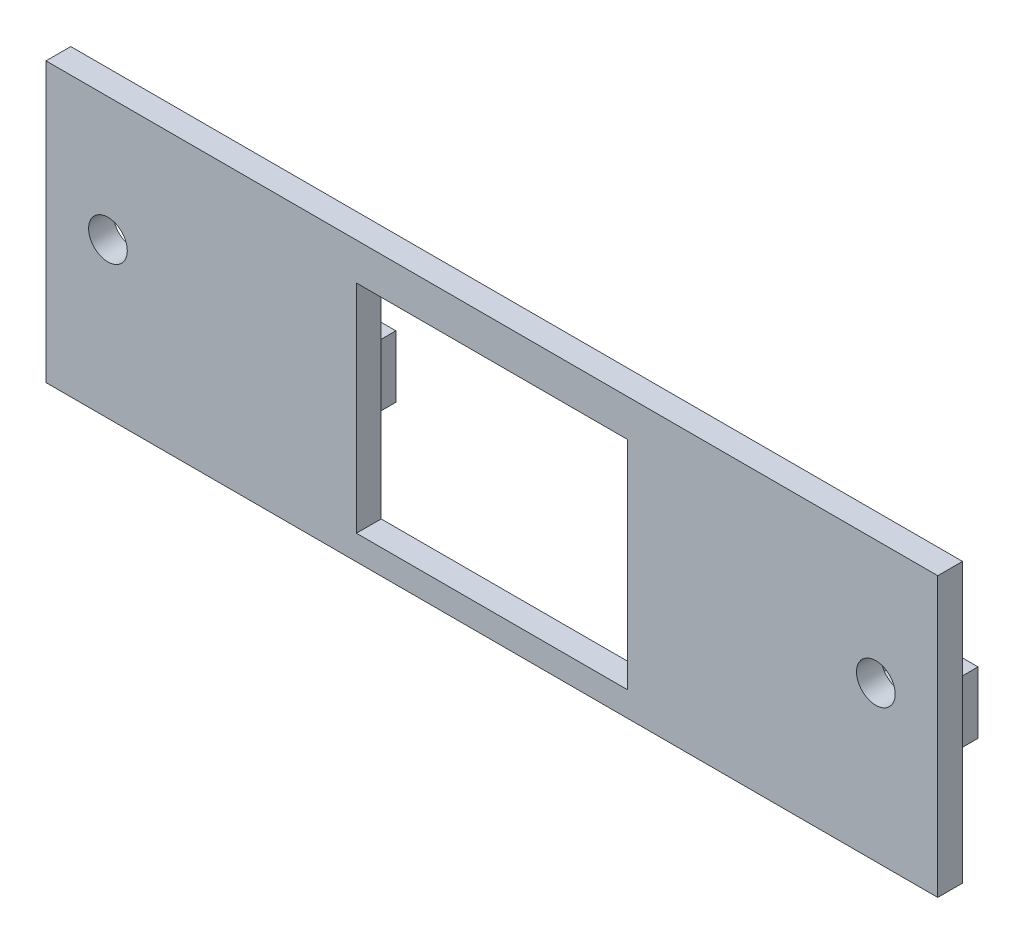
ISO-10303-21;
HEADER;
FILE_DESCRIPTION(('STEP AP214'),'2;1');
FILE_NAME('part.step','',(''),(''),'','','');
FILE_SCHEMA(('AUTOMOTIVE_DESIGN { 1 0 10303 214 1 1 1 1 }'));
ENDSEC;
DATA;
#1=APPLICATION_CONTEXT('core data for automotive mechanical design processes');
#2=APPLICATION_PROTOCOL_DEFINITION('international standard','automotive_design',2000,#1);
#3=PRODUCT_CONTEXT('',#1,'mechanical');
#4=PRODUCT('Part','Part','',(#3));
#5=PRODUCT_RELATED_PRODUCT_CATEGORY('part','',(#4));
#6=PRODUCT_DEFINITION_FORMATION('','',#4);
#7=PRODUCT_DEFINITION_CONTEXT('part definition',#1,'design');
#8=PRODUCT_DEFINITION('design','',#6,#7);
#9=PRODUCT_DEFINITION_SHAPE('','',#8);
#10=(LENGTH_UNIT() NAMED_UNIT(*) SI_UNIT(.MILLI.,.METRE.));
#11=(NAMED_UNIT(*) PLANE_ANGLE_UNIT() SI_UNIT($,.RADIAN.));
#12=(NAMED_UNIT(*) SI_UNIT($,.STERADIAN.) SOLID_ANGLE_UNIT());
#13=UNCERTAINTY_MEASURE_WITH_UNIT(LENGTH_MEASURE(1.E-05),#10,'distance_accuracy_value','');
#14=(GEOMETRIC_REPRESENTATION_CONTEXT(3) GLOBAL_UNCERTAINTY_ASSIGNED_CONTEXT((#13)) GLOBAL_UNIT_ASSIGNED_CONTEXT((#10,
#11,#12)) REPRESENTATION_CONTEXT('',''));
#15=CARTESIAN_POINT('',(0.,0.,0.));
#16=DIRECTION('',(0.,0.,1.));
#17=DIRECTION('',(1.,0.,0.));
#18=AXIS2_PLACEMENT_3D('',#15,#16,#17);
#19=CARTESIAN_POINT('',(0.,5.6,0.));
#20=DIRECTION('',(0.,-1.,0.));
#21=DIRECTION('',(0.,0.,-1.));
#22=AXIS2_PLACEMENT_3D('',#19,#20,#21);
#23=PLANE('',#22);
#24=DIRECTION('',(0.,0.,1.));
#25=VECTOR('',#24,1.);
#26=CARTESIAN_POINT('',(-22.8,5.6,0.));
#27=LINE('',#26,#25);
#28=CARTESIAN_POINT('',(-22.8,5.6,-7.));
#29=VERTEX_POINT('',#28);
#30=CARTESIAN_POINT('',(-22.8,5.6,-0.5));
#31=VERTEX_POINT('',#30);
#32=EDGE_CURVE('E301',#29,#31,#27,.T.);
#33=ORIENTED_EDGE('',*,*,#32,.T.);
#34=DIRECTION('',(1.,0.,0.));
#35=VECTOR('',#34,1.);
#36=CARTESIAN_POINT('',(-14.8,5.6,-0.5));
#37=LINE('',#36,#35);
#38=CARTESIAN_POINT('',(-14.8,5.6,-0.5));
#39=VERTEX_POINT('',#38);
#40=EDGE_CURVE('E344',#31,#39,#37,.T.);
#41=ORIENTED_EDGE('',*,*,#40,.T.);
#42=DIRECTION('',(0.,0.,-1.));
#43=VECTOR('',#42,1.);
#44=CARTESIAN_POINT('',(-14.8,5.6,0.));
#45=LINE('',#44,#43);
#46=CARTESIAN_POINT('',(-14.8,5.6,-7.));
#47=VERTEX_POINT('',#46);
#48=EDGE_CURVE('E302',#39,#47,#45,.T.);
#49=ORIENTED_EDGE('',*,*,#48,.T.);
#50=DIRECTION('',(-1.,0.,0.));
#51=VECTOR('',#50,1.);
#52=CARTESIAN_POINT('',(-22.8,5.6,-7.));
#53=LINE('',#52,#51);
#54=EDGE_CURVE('E310',#47,#29,#53,.T.);
#55=ORIENTED_EDGE('',*,*,#54,.T.);
#56=EDGE_LOOP('',(#33,#41,#49,#55));
#57=FACE_BOUND('',#56,.T.);
#58=CARTESIAN_POINT('',(-18.8,5.6,-4.2));
#59=DIRECTION('',(0.,1.,0.));
#60=DIRECTION('',(0.,0.,1.));
#61=AXIS2_PLACEMENT_3D('',#58,#59,#60);
#62=CIRCLE('',#61,1.3);
#63=CARTESIAN_POINT('',(-18.8,5.6,-2.9));
#64=VERTEX_POINT('',#63);
#65=EDGE_CURVE('E294',#64,#64,#62,.T.);
#66=ORIENTED_EDGE('',*,*,#65,.F.);
#67=EDGE_LOOP('',(#66));
#68=FACE_BOUND('',#67,.T.);
#69=ADVANCED_FACE('F41',(#57,#68),#23,.F.);
#70=CARTESIAN_POINT('',(0.,1.6,0.));
#71=DIRECTION('',(0.,-1.,0.));
#72=DIRECTION('',(0.,0.,-1.));
#73=AXIS2_PLACEMENT_3D('',#70,#71,#72);
#74=PLANE('',#73);
#75=DIRECTION('',(0.,0.,1.));
#76=VECTOR('',#75,1.);
#77=CARTESIAN_POINT('',(-22.8,1.6,0.));
#78=LINE('',#77,#76);
#79=CARTESIAN_POINT('',(-22.8,1.6,-7.));
#80=VERTEX_POINT('',#79);
#81=CARTESIAN_POINT('',(-22.8,1.6,-0.5));
#82=VERTEX_POINT('',#81);
#83=EDGE_CURVE('E296',#80,#82,#78,.T.);
#84=ORIENTED_EDGE('',*,*,#83,.F.);
#85=DIRECTION('',(-1.,0.,0.));
#86=VECTOR('',#85,1.);
#87=CARTESIAN_POINT('',(-22.8,1.6,-7.));
#88=LINE('',#87,#86);
#89=CARTESIAN_POINT('',(-14.8,1.6,-7.));
#90=VERTEX_POINT('',#89);
#91=EDGE_CURVE('E304',#90,#80,#88,.T.);
#92=ORIENTED_EDGE('',*,*,#91,.F.);
#93=DIRECTION('',(0.,0.,-1.));
#94=VECTOR('',#93,1.);
#95=CARTESIAN_POINT('',(-14.8,1.6,0.));
#96=LINE('',#95,#94);
#97=CARTESIAN_POINT('',(-14.8,1.6,-0.5));
#98=VERTEX_POINT('',#97);
#99=EDGE_CURVE('E313',#98,#90,#96,.T.);
#100=ORIENTED_EDGE('',*,*,#99,.F.);
#101=CARTESIAN_POINT('',(-14.3,1.6,-0.5));
#102=DIRECTION('',(0.,-1.,0.));
#103=DIRECTION('',(0.,0.,-1.));
#104=AXIS2_PLACEMENT_3D('',#101,#102,#103);
#105=CIRCLE('',#104,0.5);
#106=CARTESIAN_POINT('',(-14.3,1.6,0.));
#107=VERTEX_POINT('',#106);
#108=EDGE_CURVE('E350',#98,#107,#105,.F.);
#109=ORIENTED_EDGE('',*,*,#108,.T.);
#110=DIRECTION('',(1.,0.,0.));
#111=VECTOR('',#110,1.);
#112=CARTESIAN_POINT('',(-22.8,1.6,0.));
#113=LINE('',#112,#111);
#114=CARTESIAN_POINT('',(-23.3,1.6,0.));
#115=VERTEX_POINT('',#114);
#116=EDGE_CURVE('E315',#115,#107,#113,.T.);
#117=ORIENTED_EDGE('',*,*,#116,.F.);
#118=CARTESIAN_POINT('',(-23.3,1.6,-0.5));
#119=DIRECTION('',(0.,-1.,0.));
#120=DIRECTION('',(0.,0.,-1.));
#121=AXIS2_PLACEMENT_3D('',#118,#119,#120);
#122=CIRCLE('',#121,0.5);
#123=EDGE_CURVE('E349',#115,#82,#122,.F.);
#124=ORIENTED_EDGE('',*,*,#123,.T.);
#125=EDGE_LOOP('',(#84,#92,#100,#109,#117,#124));
#126=FACE_BOUND('',#125,.T.);
#127=CARTESIAN_POINT('',(-18.8,1.6,-4.2));
#128=DIRECTION('',(0.,1.,0.));
#129=DIRECTION('',(0.,0.,1.));
#130=AXIS2_PLACEMENT_3D('',#127,#128,#129);
#131=CIRCLE('',#130,1.3);
#132=CARTESIAN_POINT('',(-18.8,1.6,-2.9));
#133=VERTEX_POINT('',#132);
#134=EDGE_CURVE('E295',#133,#133,#131,.T.);
#135=ORIENTED_EDGE('',*,*,#134,.T.);
#136=EDGE_LOOP('',(#135));
#137=FACE_BOUND('',#136,.T.);
#138=ADVANCED_FACE('F392',(#126,#137),#74,.T.);
#139=CARTESIAN_POINT('',(-22.8,5.6,0.));
#140=DIRECTION('',(1.,0.,0.));
#141=DIRECTION('',(0.,0.,-1.));
#142=AXIS2_PLACEMENT_3D('',#139,#140,#141);
#143=PLANE('',#142);
#144=ORIENTED_EDGE('',*,*,#83,.T.);
#145=DIRECTION('',(0.,-1.,0.));
#146=VECTOR('',#145,1.);
#147=CARTESIAN_POINT('',(-22.8,5.6,-0.5));
#148=LINE('',#147,#146);
#149=EDGE_CURVE('E339',#82,#31,#148,.F.);
#150=ORIENTED_EDGE('',*,*,#149,.T.);
#151=ORIENTED_EDGE('',*,*,#32,.F.);
#152=DIRECTION('',(0.,-1.,0.));
#153=VECTOR('',#152,1.);
#154=CARTESIAN_POINT('',(-22.8,5.6,-7.));
#155=LINE('',#154,#153);
#156=EDGE_CURVE('E307',#29,#80,#155,.T.);
#157=ORIENTED_EDGE('',*,*,#156,.T.);
#158=EDGE_LOOP('',(#144,#150,#151,#157));
#159=FACE_BOUND('',#158,.T.);
#160=ADVANCED_FACE('F402',(#159),#143,.F.);
#161=CARTESIAN_POINT('',(-14.8,5.6,0.));
#162=DIRECTION('',(-1.,0.,0.));
#163=DIRECTION('',(0.,0.,1.));
#164=AXIS2_PLACEMENT_3D('',#161,#162,#163);
#165=PLANE('',#164);
#166=ORIENTED_EDGE('',*,*,#48,.F.);
#167=DIRECTION('',(0.,-1.,0.));
#168=VECTOR('',#167,1.);
#169=CARTESIAN_POINT('',(-14.8,1.6,-0.5));
#170=LINE('',#169,#168);
#171=EDGE_CURVE('E321',#39,#98,#170,.T.);
#172=ORIENTED_EDGE('',*,*,#171,.T.);
#173=ORIENTED_EDGE('',*,*,#99,.T.);
#174=DIRECTION('',(0.,-1.,0.));
#175=VECTOR('',#174,1.);
#176=CARTESIAN_POINT('',(-14.8,5.6,-7.));
#177=LINE('',#176,#175);
#178=EDGE_CURVE('E316',#47,#90,#177,.T.);
#179=ORIENTED_EDGE('',*,*,#178,.F.);
#180=EDGE_LOOP('',(#166,#172,#173,#179));
#181=FACE_BOUND('',#180,.T.);
#182=ADVANCED_FACE('F415',(#181),#165,.F.);
#183=CARTESIAN_POINT('',(-22.8,5.6,-7.));
#184=DIRECTION('',(0.,0.,1.));
#185=DIRECTION('',(1.,0.,0.));
#186=AXIS2_PLACEMENT_3D('',#183,#184,#185);
#187=PLANE('',#186);
#188=ORIENTED_EDGE('',*,*,#91,.T.);
#189=ORIENTED_EDGE('',*,*,#156,.F.);
#190=ORIENTED_EDGE('',*,*,#54,.F.);
#191=ORIENTED_EDGE('',*,*,#178,.T.);
#192=EDGE_LOOP('',(#188,#189,#190,#191));
#193=FACE_BOUND('',#192,.T.);
#194=ADVANCED_FACE('F408',(#193),#187,.F.);
#195=CARTESIAN_POINT('',(-18.8,5.6,-4.2));
#196=DIRECTION('',(0.,-1.,0.));
#197=DIRECTION('',(0.,0.,-1.));
#198=AXIS2_PLACEMENT_3D('',#195,#196,#197);
#199=CYLINDRICAL_SURFACE('',#198,1.3);
#200=ORIENTED_EDGE('',*,*,#65,.T.);
#201=EDGE_LOOP('',(#200));
#202=FACE_BOUND('',#201,.T.);
#203=ORIENTED_EDGE('',*,*,#134,.F.);
#204=EDGE_LOOP('',(#203));
#205=FACE_BOUND('',#204,.T.);
#206=ADVANCED_FACE('F409',(#202,#205),#199,.F.);
#207=CARTESIAN_POINT('',(0.,0.,0.));
#208=DIRECTION('',(0.,0.,1.));
#209=DIRECTION('',(1.,0.,0.));
#210=AXIS2_PLACEMENT_3D('',#207,#208,#209);
#211=PLANE('',#210);
#212=DIRECTION('',(0.,-1.,0.));
#213=VECTOR('',#212,1.);
#214=CARTESIAN_POINT('',(14.3,1.6,0.));
#215=LINE('',#214,#213);
#216=CARTESIAN_POINT('',(14.3,6.1,0.));
#217=VERTEX_POINT('',#216);
#218=CARTESIAN_POINT('',(14.3,1.6,0.));
#219=VERTEX_POINT('',#218);
#220=EDGE_CURVE('E327',#217,#219,#215,.T.);
#221=ORIENTED_EDGE('',*,*,#220,.T.);
#222=DIRECTION('',(1.,0.,0.));
#223=VECTOR('',#222,1.);
#224=CARTESIAN_POINT('',(22.8,1.6,0.));
#225=LINE('',#224,#223);
#226=CARTESIAN_POINT('',(23.3,1.6,0.));
#227=VERTEX_POINT('',#226);
#228=EDGE_CURVE('E201',#219,#227,#225,.T.);
#229=ORIENTED_EDGE('',*,*,#228,.T.);
#230=DIRECTION('',(0.,-1.,0.));
#231=VECTOR('',#230,1.);
#232=CARTESIAN_POINT('',(23.3,5.6,0.));
#233=LINE('',#232,#231);
#234=CARTESIAN_POINT('',(23.3,6.1,0.));
#235=VERTEX_POINT('',#234);
#236=EDGE_CURVE('E330',#227,#235,#233,.F.);
#237=ORIENTED_EDGE('',*,*,#236,.T.);
#238=DIRECTION('',(1.,0.,0.));
#239=VECTOR('',#238,1.);
#240=CARTESIAN_POINT('',(0.,6.1,0.));
#241=LINE('',#240,#239);
#242=EDGE_CURVE('E322',#235,#217,#241,.F.);
#243=ORIENTED_EDGE('',*,*,#242,.T.);
#244=EDGE_LOOP('',(#221,#229,#237,#243));
#245=FACE_BOUND('',#244,.T.);
#246=DIRECTION('',(-1.,0.,0.));
#247=VECTOR('',#246,1.);
#248=CARTESIAN_POINT('',(0.,15.6,0.));
#249=LINE('',#248,#247);
#250=CARTESIAN_POINT('',(8.75,15.6,0.));
#251=VERTEX_POINT('',#250);
#252=CARTESIAN_POINT('',(-8.75,15.6,0.));
#253=VERTEX_POINT('',#252);
#254=EDGE_CURVE('E289',#251,#253,#249,.T.);
#255=ORIENTED_EDGE('',*,*,#254,.T.);
#256=DIRECTION('',(0.,-1.,0.));
#257=VECTOR('',#256,1.);
#258=CARTESIAN_POINT('',(-8.75,0.,0.));
#259=LINE('',#258,#257);
#260=CARTESIAN_POINT('',(-8.75,1.6,0.));
#261=VERTEX_POINT('',#260);
#262=EDGE_CURVE('E293',#253,#261,#259,.T.);
#263=ORIENTED_EDGE('',*,*,#262,.T.);
#264=DIRECTION('',(1.,0.,0.));
#265=VECTOR('',#264,1.);
#266=CARTESIAN_POINT('',(0.,1.6,0.));
#267=LINE('',#266,#265);
#268=CARTESIAN_POINT('',(8.75,1.6,0.));
#269=VERTEX_POINT('',#268);
#270=EDGE_CURVE('E285',#261,#269,#267,.T.);
#271=ORIENTED_EDGE('',*,*,#270,.T.);
#272=DIRECTION('',(0.,1.,0.));
#273=VECTOR('',#272,1.);
#274=CARTESIAN_POINT('',(8.75,0.,0.));
#275=LINE('',#274,#273);
#276=EDGE_CURVE('E284',#269,#251,#275,.T.);
#277=ORIENTED_EDGE('',*,*,#276,.T.);
#278=EDGE_LOOP('',(#255,#263,#271,#277));
#279=FACE_BOUND('',#278,.T.);
#280=DIRECTION('',(0.,-1.,0.));
#281=VECTOR('',#280,1.);
#282=CARTESIAN_POINT('',(-28.8,18.,0.));
#283=LINE('',#282,#281);
#284=CARTESIAN_POINT('',(-28.8,18.,0.));
#285=VERTEX_POINT('',#284);
#286=CARTESIAN_POINT('',(-28.8,0.,0.));
#287=VERTEX_POINT('',#286);
#288=EDGE_CURVE('E249',#285,#287,#283,.T.);
#289=ORIENTED_EDGE('',*,*,#288,.F.);
#290=DIRECTION('',(-1.,0.,0.));
#291=VECTOR('',#290,1.);
#292=CARTESIAN_POINT('',(-28.8,18.,0.));
#293=LINE('',#292,#291);
#294=CARTESIAN_POINT('',(28.8,18.,0.));
#295=VERTEX_POINT('',#294);
#296=EDGE_CURVE('E256',#295,#285,#293,.T.);
#297=ORIENTED_EDGE('',*,*,#296,.F.);
#298=DIRECTION('',(0.,1.,0.));
#299=VECTOR('',#298,1.);
#300=CARTESIAN_POINT('',(28.8,18.,0.));
#301=LINE('',#300,#299);
#302=CARTESIAN_POINT('',(28.8,0.,0.));
#303=VERTEX_POINT('',#302);
#304=EDGE_CURVE('E269',#303,#295,#301,.T.);
#305=ORIENTED_EDGE('',*,*,#304,.F.);
#306=DIRECTION('',(1.,0.,0.));
#307=VECTOR('',#306,1.);
#308=CARTESIAN_POINT('',(-28.8,0.,0.));
#309=LINE('',#308,#307);
#310=EDGE_CURVE('E267',#287,#303,#309,.T.);
#311=ORIENTED_EDGE('',*,*,#310,.F.);
#312=EDGE_LOOP('',(#289,#297,#305,#311));
#313=FACE_BOUND('',#312,.T.);
#314=CARTESIAN_POINT('',(-24.8,10.,0.));
#315=DIRECTION('',(0.,0.,1.));
#316=DIRECTION('',(1.,0.,0.));
#317=AXIS2_PLACEMENT_3D('',#314,#315,#316);
#318=CIRCLE('',#317,1.25);
#319=CARTESIAN_POINT('',(-23.55,10.,0.));
#320=VERTEX_POINT('',#319);
#321=EDGE_CURVE('E242',#320,#320,#318,.T.);
#322=ORIENTED_EDGE('',*,*,#321,.T.);
#323=EDGE_LOOP('',(#322));
#324=FACE_BOUND('',#323,.T.);
#325=CARTESIAN_POINT('',(24.8,10.,0.));
#326=DIRECTION('',(0.,0.,1.));
#327=DIRECTION('',(1.,0.,0.));
#328=AXIS2_PLACEMENT_3D('',#325,#326,#327);
#329=CIRCLE('',#328,1.25);
#330=CARTESIAN_POINT('',(26.05,10.,0.));
#331=VERTEX_POINT('',#330);
#332=EDGE_CURVE('E234',#331,#331,#329,.T.);
#333=ORIENTED_EDGE('',*,*,#332,.T.);
#334=EDGE_LOOP('',(#333));
#335=FACE_BOUND('',#334,.T.);
#336=DIRECTION('',(0.,-1.,0.));
#337=VECTOR('',#336,1.);
#338=CARTESIAN_POINT('',(-23.3,1.6,0.));
#339=LINE('',#338,#337);
#340=CARTESIAN_POINT('',(-23.3,6.1,0.));
#341=VERTEX_POINT('',#340);
#342=EDGE_CURVE('E331',#341,#115,#339,.T.);
#343=ORIENTED_EDGE('',*,*,#342,.T.);
#344=ORIENTED_EDGE('',*,*,#116,.T.);
#345=DIRECTION('',(0.,-1.,0.));
#346=VECTOR('',#345,1.);
#347=CARTESIAN_POINT('',(-14.3,5.6,0.));
#348=LINE('',#347,#346);
#349=CARTESIAN_POINT('',(-14.3,6.1,0.));
#350=VERTEX_POINT('',#349);
#351=EDGE_CURVE('E340',#107,#350,#348,.F.);
#352=ORIENTED_EDGE('',*,*,#351,.T.);
#353=DIRECTION('',(1.,0.,0.));
#354=VECTOR('',#353,1.);
#355=CARTESIAN_POINT('',(-22.8,6.1,0.));
#356=LINE('',#355,#354);
#357=EDGE_CURVE('E335',#350,#341,#356,.F.);
#358=ORIENTED_EDGE('',*,*,#357,.T.);
#359=EDGE_LOOP('',(#343,#344,#352,#358));
#360=FACE_BOUND('',#359,.T.);
#361=ADVANCED_FACE('F616',(#245,#279,#313,#324,#335,#360),#211,.F.);
#362=CARTESIAN_POINT('',(0.,0.,1.6));
#363=DIRECTION('',(0.,0.,1.));
#364=DIRECTION('',(1.,0.,0.));
#365=AXIS2_PLACEMENT_3D('',#362,#363,#364);
#366=PLANE('',#365);
#367=DIRECTION('',(0.,-1.,0.));
#368=VECTOR('',#367,1.);
#369=CARTESIAN_POINT('',(-8.75,15.6,1.6));
#370=LINE('',#369,#368);
#371=CARTESIAN_POINT('',(-8.75,15.6,1.6));
#372=VERTEX_POINT('',#371);
#373=CARTESIAN_POINT('',(-8.75,1.6,1.6));
#374=VERTEX_POINT('',#373);
#375=EDGE_CURVE('E218',#372,#374,#370,.T.);
#376=ORIENTED_EDGE('',*,*,#375,.F.);
#377=DIRECTION('',(-1.,0.,0.));
#378=VECTOR('',#377,1.);
#379=CARTESIAN_POINT('',(-8.75,15.6,1.6));
#380=LINE('',#379,#378);
#381=CARTESIAN_POINT('',(8.75,15.6,1.6));
#382=VERTEX_POINT('',#381);
#383=EDGE_CURVE('E226',#382,#372,#380,.T.);
#384=ORIENTED_EDGE('',*,*,#383,.F.);
#385=DIRECTION('',(0.,1.,0.));
#386=VECTOR('',#385,1.);
#387=CARTESIAN_POINT('',(8.75,15.6,1.6));
#388=LINE('',#387,#386);
#389=CARTESIAN_POINT('',(8.75,1.6,1.6));
#390=VERTEX_POINT('',#389);
#391=EDGE_CURVE('E223',#390,#382,#388,.T.);
#392=ORIENTED_EDGE('',*,*,#391,.F.);
#393=DIRECTION('',(1.,0.,0.));
#394=VECTOR('',#393,1.);
#395=CARTESIAN_POINT('',(-8.75,1.6,1.6));
#396=LINE('',#395,#394);
#397=EDGE_CURVE('E225',#374,#390,#396,.T.);
#398=ORIENTED_EDGE('',*,*,#397,.F.);
#399=EDGE_LOOP('',(#376,#384,#392,#398));
#400=FACE_BOUND('',#399,.T.);
#401=CARTESIAN_POINT('',(-24.8,10.,1.6));
#402=DIRECTION('',(0.,0.,1.));
#403=DIRECTION('',(1.,0.,0.));
#404=AXIS2_PLACEMENT_3D('',#401,#402,#403);
#405=CIRCLE('',#404,1.25);
#406=CARTESIAN_POINT('',(-23.55,10.,1.6));
#407=VERTEX_POINT('',#406);
#408=EDGE_CURVE('E250',#407,#407,#405,.T.);
#409=ORIENTED_EDGE('',*,*,#408,.F.);
#410=EDGE_LOOP('',(#409));
#411=FACE_BOUND('',#410,.T.);
#412=DIRECTION('',(0.,-1.,0.));
#413=VECTOR('',#412,1.);
#414=CARTESIAN_POINT('',(-28.8,18.,1.6));
#415=LINE('',#414,#413);
#416=CARTESIAN_POINT('',(-28.8,18.,1.6));
#417=VERTEX_POINT('',#416);
#418=CARTESIAN_POINT('',(-28.8,0.,1.6));
#419=VERTEX_POINT('',#418);
#420=EDGE_CURVE('E254',#417,#419,#415,.T.);
#421=ORIENTED_EDGE('',*,*,#420,.T.);
#422=DIRECTION('',(1.,0.,0.));
#423=VECTOR('',#422,1.);
#424=CARTESIAN_POINT('',(-28.8,0.,1.6));
#425=LINE('',#424,#423);
#426=CARTESIAN_POINT('',(28.8,0.,1.6));
#427=VERTEX_POINT('',#426);
#428=EDGE_CURVE('E259',#419,#427,#425,.T.);
#429=ORIENTED_EDGE('',*,*,#428,.T.);
#430=DIRECTION('',(0.,1.,0.));
#431=VECTOR('',#430,1.);
#432=CARTESIAN_POINT('',(28.8,18.,1.6));
#433=LINE('',#432,#431);
#434=CARTESIAN_POINT('',(28.8,18.,1.6));
#435=VERTEX_POINT('',#434);
#436=EDGE_CURVE('E258',#427,#435,#433,.T.);
#437=ORIENTED_EDGE('',*,*,#436,.T.);
#438=DIRECTION('',(-1.,0.,0.));
#439=VECTOR('',#438,1.);
#440=CARTESIAN_POINT('',(-28.8,18.,1.6));
#441=LINE('',#440,#439);
#442=EDGE_CURVE('E261',#435,#417,#441,.T.);
#443=ORIENTED_EDGE('',*,*,#442,.T.);
#444=EDGE_LOOP('',(#421,#429,#437,#443));
#445=FACE_BOUND('',#444,.T.);
#446=CARTESIAN_POINT('',(24.8,10.,1.6));
#447=DIRECTION('',(0.,0.,1.));
#448=DIRECTION('',(1.,0.,0.));
#449=AXIS2_PLACEMENT_3D('',#446,#447,#448);
#450=CIRCLE('',#449,1.25);
#451=CARTESIAN_POINT('',(26.05,10.,1.6));
#452=VERTEX_POINT('',#451);
#453=EDGE_CURVE('E241',#452,#452,#450,.T.);
#454=ORIENTED_EDGE('',*,*,#453,.F.);
#455=EDGE_LOOP('',(#454));
#456=FACE_BOUND('',#455,.T.);
#457=ADVANCED_FACE('F607',(#400,#411,#445,#456),#366,.T.);
#458=CARTESIAN_POINT('',(-28.8,18.,1.6));
#459=DIRECTION('',(1.,0.,0.));
#460=DIRECTION('',(0.,0.,-1.));
#461=AXIS2_PLACEMENT_3D('',#458,#459,#460);
#462=PLANE('',#461);
#463=ORIENTED_EDGE('',*,*,#288,.T.);
#464=DIRECTION('',(0.,0.,-1.));
#465=VECTOR('',#464,1.);
#466=CARTESIAN_POINT('',(-28.8,0.,1.6));
#467=LINE('',#466,#465);
#468=EDGE_CURVE('E278',#419,#287,#467,.T.);
#469=ORIENTED_EDGE('',*,*,#468,.F.);
#470=ORIENTED_EDGE('',*,*,#420,.F.);
#471=DIRECTION('',(0.,0.,-1.));
#472=VECTOR('',#471,1.);
#473=CARTESIAN_POINT('',(-28.8,18.,1.6));
#474=LINE('',#473,#472);
#475=EDGE_CURVE('E263',#417,#285,#474,.T.);
#476=ORIENTED_EDGE('',*,*,#475,.T.);
#477=EDGE_LOOP('',(#463,#469,#470,#476));
#478=FACE_BOUND('',#477,.T.);
#479=ADVANCED_FACE('F599',(#478),#462,.F.);
#480=CARTESIAN_POINT('',(-28.8,0.,1.6));
#481=DIRECTION('',(0.,1.,0.));
#482=DIRECTION('',(-1.,0.,0.));
#483=AXIS2_PLACEMENT_3D('',#480,#481,#482);
#484=PLANE('',#483);
#485=ORIENTED_EDGE('',*,*,#310,.T.);
#486=DIRECTION('',(0.,0.,-1.));
#487=VECTOR('',#486,1.);
#488=CARTESIAN_POINT('',(28.8,0.,1.6));
#489=LINE('',#488,#487);
#490=EDGE_CURVE('E279',#427,#303,#489,.T.);
#491=ORIENTED_EDGE('',*,*,#490,.F.);
#492=ORIENTED_EDGE('',*,*,#428,.F.);
#493=ORIENTED_EDGE('',*,*,#468,.T.);
#494=EDGE_LOOP('',(#485,#491,#492,#493));
#495=FACE_BOUND('',#494,.T.);
#496=ADVANCED_FACE('F587',(#495),#484,.F.);
#497=CARTESIAN_POINT('',(28.8,18.,1.6));
#498=DIRECTION('',(-1.,0.,0.));
#499=DIRECTION('',(0.,-1.,0.));
#500=AXIS2_PLACEMENT_3D('',#497,#498,#499);
#501=PLANE('',#500);
#502=ORIENTED_EDGE('',*,*,#304,.T.);
#503=DIRECTION('',(0.,0.,-1.));
#504=VECTOR('',#503,1.);
#505=CARTESIAN_POINT('',(28.8,18.,1.6));
#506=LINE('',#505,#504);
#507=EDGE_CURVE('E271',#435,#295,#506,.T.);
#508=ORIENTED_EDGE('',*,*,#507,.F.);
#509=ORIENTED_EDGE('',*,*,#436,.F.);
#510=ORIENTED_EDGE('',*,*,#490,.T.);
#511=EDGE_LOOP('',(#502,#508,#509,#510));
#512=FACE_BOUND('',#511,.T.);
#513=ADVANCED_FACE('F576',(#512),#501,.F.);
#514=CARTESIAN_POINT('',(-28.8,18.,1.6));
#515=DIRECTION('',(0.,-1.,0.));
#516=DIRECTION('',(1.,0.,0.));
#517=AXIS2_PLACEMENT_3D('',#514,#515,#516);
#518=PLANE('',#517);
#519=ORIENTED_EDGE('',*,*,#296,.T.);
#520=ORIENTED_EDGE('',*,*,#475,.F.);
#521=ORIENTED_EDGE('',*,*,#442,.F.);
#522=ORIENTED_EDGE('',*,*,#507,.T.);
#523=EDGE_LOOP('',(#519,#520,#521,#522));
#524=FACE_BOUND('',#523,.T.);
#525=ADVANCED_FACE('F567',(#524),#518,.F.);
#526=CARTESIAN_POINT('',(-24.8,10.,1.6));
#527=DIRECTION('',(0.,0.,-1.));
#528=DIRECTION('',(-1.,0.,0.));
#529=AXIS2_PLACEMENT_3D('',#526,#527,#528);
#530=CYLINDRICAL_SURFACE('',#529,1.25);
#531=ORIENTED_EDGE('',*,*,#408,.T.);
#532=EDGE_LOOP('',(#531));
#533=FACE_BOUND('',#532,.T.);
#534=ORIENTED_EDGE('',*,*,#321,.F.);
#535=EDGE_LOOP('',(#534));
#536=FACE_BOUND('',#535,.T.);
#537=ADVANCED_FACE('F559',(#533,#536),#530,.F.);
#538=CARTESIAN_POINT('',(24.8,10.,1.6));
#539=DIRECTION('',(0.,0.,-1.));
#540=DIRECTION('',(-1.,0.,0.));
#541=AXIS2_PLACEMENT_3D('',#538,#539,#540);
#542=CYLINDRICAL_SURFACE('',#541,1.25);
#543=ORIENTED_EDGE('',*,*,#453,.T.);
#544=EDGE_LOOP('',(#543));
#545=FACE_BOUND('',#544,.T.);
#546=ORIENTED_EDGE('',*,*,#332,.F.);
#547=EDGE_LOOP('',(#546));
#548=FACE_BOUND('',#547,.T.);
#549=ADVANCED_FACE('F546',(#545,#548),#542,.F.);
#550=CARTESIAN_POINT('',(-8.75,15.6,-7.));
#551=DIRECTION('',(-1.,0.,0.));
#552=DIRECTION('',(0.,0.,1.));
#553=AXIS2_PLACEMENT_3D('',#550,#551,#552);
#554=PLANE('',#553);
#555=DIRECTION('',(0.,0.,1.));
#556=VECTOR('',#555,1.);
#557=CARTESIAN_POINT('',(-8.75,15.6,-7.));
#558=LINE('',#557,#556);
#559=EDGE_CURVE('E235',#253,#372,#558,.T.);
#560=ORIENTED_EDGE('',*,*,#559,.T.);
#561=ORIENTED_EDGE('',*,*,#375,.T.);
#562=DIRECTION('',(0.,0.,1.));
#563=VECTOR('',#562,1.);
#564=CARTESIAN_POINT('',(-8.75,1.6,-7.));
#565=LINE('',#564,#563);
#566=EDGE_CURVE('E233',#261,#374,#565,.T.);
#567=ORIENTED_EDGE('',*,*,#566,.F.);
#568=ORIENTED_EDGE('',*,*,#262,.F.);
#569=EDGE_LOOP('',(#560,#561,#567,#568));
#570=FACE_BOUND('',#569,.T.);
#571=ADVANCED_FACE('F538',(#570),#554,.F.);
#572=CARTESIAN_POINT('',(-8.75,15.6,-7.));
#573=DIRECTION('',(0.,1.,0.));
#574=DIRECTION('',(0.,0.,1.));
#575=AXIS2_PLACEMENT_3D('',#572,#573,#574);
#576=PLANE('',#575);
#577=DIRECTION('',(0.,0.,1.));
#578=VECTOR('',#577,1.);
#579=CARTESIAN_POINT('',(8.75,15.6,-7.));
#580=LINE('',#579,#578);
#581=EDGE_CURVE('E232',#251,#382,#580,.T.);
#582=ORIENTED_EDGE('',*,*,#581,.T.);
#583=ORIENTED_EDGE('',*,*,#383,.T.);
#584=ORIENTED_EDGE('',*,*,#559,.F.);
#585=ORIENTED_EDGE('',*,*,#254,.F.);
#586=EDGE_LOOP('',(#582,#583,#584,#585));
#587=FACE_BOUND('',#586,.T.);
#588=ADVANCED_FACE('F528',(#587),#576,.F.);
#589=CARTESIAN_POINT('',(8.75,15.6,-7.));
#590=DIRECTION('',(1.,0.,0.));
#591=DIRECTION('',(0.,0.,-1.));
#592=AXIS2_PLACEMENT_3D('',#589,#590,#591);
#593=PLANE('',#592);
#594=DIRECTION('',(0.,0.,1.));
#595=VECTOR('',#594,1.);
#596=CARTESIAN_POINT('',(8.75,1.6,-7.));
#597=LINE('',#596,#595);
#598=EDGE_CURVE('E240',#269,#390,#597,.T.);
#599=ORIENTED_EDGE('',*,*,#598,.T.);
#600=ORIENTED_EDGE('',*,*,#391,.T.);
#601=ORIENTED_EDGE('',*,*,#581,.F.);
#602=ORIENTED_EDGE('',*,*,#276,.F.);
#603=EDGE_LOOP('',(#599,#600,#601,#602));
#604=FACE_BOUND('',#603,.T.);
#605=ADVANCED_FACE('F521',(#604),#593,.F.);
#606=CARTESIAN_POINT('',(-8.75,1.6,-7.));
#607=DIRECTION('',(0.,-1.,0.));
#608=DIRECTION('',(0.,0.,-1.));
#609=AXIS2_PLACEMENT_3D('',#606,#607,#608);
#610=PLANE('',#609);
#611=ORIENTED_EDGE('',*,*,#566,.T.);
#612=ORIENTED_EDGE('',*,*,#397,.T.);
#613=ORIENTED_EDGE('',*,*,#598,.F.);
#614=ORIENTED_EDGE('',*,*,#270,.F.);
#615=EDGE_LOOP('',(#611,#612,#613,#614));
#616=FACE_BOUND('',#615,.T.);
#617=ADVANCED_FACE('F376',(#616),#610,.F.);
#618=CARTESIAN_POINT('',(0.,5.6,0.));
#619=DIRECTION('',(0.,1.,0.));
#620=DIRECTION('',(0.,0.,1.));
#621=AXIS2_PLACEMENT_3D('',#618,#619,#620);
#622=PLANE('',#621);
#623=DIRECTION('',(0.,0.,1.));
#624=VECTOR('',#623,1.);
#625=CARTESIAN_POINT('',(14.8,5.6,0.));
#626=LINE('',#625,#624);
#627=CARTESIAN_POINT('',(14.8,5.6,-7.));
#628=VERTEX_POINT('',#627);
#629=CARTESIAN_POINT('',(14.8,5.6,-0.5));
#630=VERTEX_POINT('',#629);
#631=EDGE_CURVE('E197',#628,#630,#626,.T.);
#632=ORIENTED_EDGE('',*,*,#631,.T.);
#633=DIRECTION('',(1.,0.,0.));
#634=VECTOR('',#633,1.);
#635=CARTESIAN_POINT('',(0.,5.6,-0.5));
#636=LINE('',#635,#634);
#637=CARTESIAN_POINT('',(22.8,5.6,-0.5));
#638=VERTEX_POINT('',#637);
#639=EDGE_CURVE('E59',#630,#638,#636,.T.);
#640=ORIENTED_EDGE('',*,*,#639,.T.);
#641=DIRECTION('',(0.,0.,-1.));
#642=VECTOR('',#641,1.);
#643=CARTESIAN_POINT('',(22.8,5.6,0.));
#644=LINE('',#643,#642);
#645=CARTESIAN_POINT('',(22.8,5.6,-7.));
#646=VERTEX_POINT('',#645);
#647=EDGE_CURVE('E207',#638,#646,#644,.T.);
#648=ORIENTED_EDGE('',*,*,#647,.T.);
#649=DIRECTION('',(-1.,0.,0.));
#650=VECTOR('',#649,1.);
#651=CARTESIAN_POINT('',(22.8,5.6,-7.));
#652=LINE('',#651,#650);
#653=EDGE_CURVE('E211',#646,#628,#652,.T.);
#654=ORIENTED_EDGE('',*,*,#653,.T.);
#655=EDGE_LOOP('',(#632,#640,#648,#654));
#656=FACE_BOUND('',#655,.T.);
#657=CARTESIAN_POINT('',(18.8,5.6,-4.2));
#658=DIRECTION('',(0.,1.,0.));
#659=DIRECTION('',(0.,0.,1.));
#660=AXIS2_PLACEMENT_3D('',#657,#658,#659);
#661=CIRCLE('',#660,1.29999999999999);
#662=CARTESIAN_POINT('',(18.8,5.6,-2.9));
#663=VERTEX_POINT('',#662);
#664=EDGE_CURVE('E208',#663,#663,#661,.T.);
#665=ORIENTED_EDGE('',*,*,#664,.F.);
#666=EDGE_LOOP('',(#665));
#667=FACE_BOUND('',#666,.T.);
#668=ADVANCED_FACE('F373',(#656,#667),#622,.T.);
#669=CARTESIAN_POINT('',(0.,1.6,0.));
#670=DIRECTION('',(0.,1.,0.));
#671=DIRECTION('',(0.,0.,1.));
#672=AXIS2_PLACEMENT_3D('',#669,#670,#671);
#673=PLANE('',#672);
#674=DIRECTION('',(0.,0.,-1.));
#675=VECTOR('',#674,1.);
#676=CARTESIAN_POINT('',(22.8,1.6,0.));
#677=LINE('',#676,#675);
#678=CARTESIAN_POINT('',(22.8,1.6,-0.499999999999999));
#679=VERTEX_POINT('',#678);
#680=CARTESIAN_POINT('',(22.8,1.6,-7.));
#681=VERTEX_POINT('',#680);
#682=EDGE_CURVE('E191',#679,#681,#677,.T.);
#683=ORIENTED_EDGE('',*,*,#682,.F.);
#684=CARTESIAN_POINT('',(23.3,1.6,-0.5));
#685=DIRECTION('',(0.,1.,0.));
#686=DIRECTION('',(0.,0.,1.));
#687=AXIS2_PLACEMENT_3D('',#684,#685,#686);
#688=CIRCLE('',#687,0.5);
#689=EDGE_CURVE('E11',#679,#227,#688,.T.);
#690=ORIENTED_EDGE('',*,*,#689,.T.);
#691=ORIENTED_EDGE('',*,*,#228,.F.);
#692=CARTESIAN_POINT('',(14.3,1.6,-0.5));
#693=DIRECTION('',(0.,1.,0.));
#694=DIRECTION('',(0.,0.,1.));
#695=AXIS2_PLACEMENT_3D('',#692,#693,#694);
#696=CIRCLE('',#695,0.5);
#697=CARTESIAN_POINT('',(14.8,1.6,-0.5));
#698=VERTEX_POINT('',#697);
#699=EDGE_CURVE('E49',#219,#698,#696,.T.);
#700=ORIENTED_EDGE('',*,*,#699,.T.);
#701=DIRECTION('',(0.,0.,1.));
#702=VECTOR('',#701,1.);
#703=CARTESIAN_POINT('',(14.8,1.6,0.));
#704=LINE('',#703,#702);
#705=CARTESIAN_POINT('',(14.8,1.6,-7.));
#706=VERTEX_POINT('',#705);
#707=EDGE_CURVE('E195',#706,#698,#704,.T.);
#708=ORIENTED_EDGE('',*,*,#707,.F.);
#709=DIRECTION('',(-1.,0.,0.));
#710=VECTOR('',#709,1.);
#711=CARTESIAN_POINT('',(22.8,1.6,-7.));
#712=LINE('',#711,#710);
#713=EDGE_CURVE('E185',#681,#706,#712,.T.);
#714=ORIENTED_EDGE('',*,*,#713,.F.);
#715=EDGE_LOOP('',(#683,#690,#691,#700,#708,#714));
#716=FACE_BOUND('',#715,.T.);
#717=CARTESIAN_POINT('',(18.8,1.6,-4.2));
#718=DIRECTION('',(0.,1.,0.));
#719=DIRECTION('',(0.,0.,1.));
#720=AXIS2_PLACEMENT_3D('',#717,#718,#719);
#721=CIRCLE('',#720,1.29999999999999);
#722=CARTESIAN_POINT('',(18.8,1.6,-2.9));
#723=VERTEX_POINT('',#722);
#724=EDGE_CURVE('E212',#723,#723,#721,.T.);
#725=ORIENTED_EDGE('',*,*,#724,.T.);
#726=EDGE_LOOP('',(#725));
#727=FACE_BOUND('',#726,.T.);
#728=ADVANCED_FACE('F202',(#716,#727),#673,.F.);
#729=CARTESIAN_POINT('',(22.8,5.6,0.));
#730=DIRECTION('',(-1.,0.,0.));
#731=DIRECTION('',(0.,0.,1.));
#732=AXIS2_PLACEMENT_3D('',#729,#730,#731);
#733=PLANE('',#732);
#734=ORIENTED_EDGE('',*,*,#647,.F.);
#735=DIRECTION('',(0.,-1.,0.));
#736=VECTOR('',#735,1.);
#737=CARTESIAN_POINT('',(22.8,1.6,-0.499999999999999));
#738=LINE('',#737,#736);
#739=EDGE_CURVE('E62',#638,#679,#738,.T.);
#740=ORIENTED_EDGE('',*,*,#739,.T.);
#741=ORIENTED_EDGE('',*,*,#682,.T.);
#742=DIRECTION('',(0.,-1.,0.));
#743=VECTOR('',#742,1.);
#744=CARTESIAN_POINT('',(22.8,5.6,-7.));
#745=LINE('',#744,#743);
#746=EDGE_CURVE('E186',#646,#681,#745,.T.);
#747=ORIENTED_EDGE('',*,*,#746,.F.);
#748=EDGE_LOOP('',(#734,#740,#741,#747));
#749=FACE_BOUND('',#748,.T.);
#750=ADVANCED_FACE('F371',(#749),#733,.F.);
#751=CARTESIAN_POINT('',(22.8,5.6,-7.));
#752=DIRECTION('',(0.,0.,1.));
#753=DIRECTION('',(1.,0.,0.));
#754=AXIS2_PLACEMENT_3D('',#751,#752,#753);
#755=PLANE('',#754);
#756=ORIENTED_EDGE('',*,*,#713,.T.);
#757=DIRECTION('',(0.,-1.,0.));
#758=VECTOR('',#757,1.);
#759=CARTESIAN_POINT('',(14.8,5.6,-7.));
#760=LINE('',#759,#758);
#761=EDGE_CURVE('E187',#628,#706,#760,.T.);
#762=ORIENTED_EDGE('',*,*,#761,.F.);
#763=ORIENTED_EDGE('',*,*,#653,.F.);
#764=ORIENTED_EDGE('',*,*,#746,.T.);
#765=EDGE_LOOP('',(#756,#762,#763,#764));
#766=FACE_BOUND('',#765,.T.);
#767=ADVANCED_FACE('F183',(#766),#755,.F.);
#768=CARTESIAN_POINT('',(14.8,5.6,0.));
#769=DIRECTION('',(1.,0.,0.));
#770=DIRECTION('',(0.,0.,-1.));
#771=AXIS2_PLACEMENT_3D('',#768,#769,#770);
#772=PLANE('',#771);
#773=ORIENTED_EDGE('',*,*,#707,.T.);
#774=DIRECTION('',(0.,-1.,0.));
#775=VECTOR('',#774,1.);
#776=CARTESIAN_POINT('',(14.8,5.6,-0.5));
#777=LINE('',#776,#775);
#778=EDGE_CURVE('E345',#698,#630,#777,.F.);
#779=ORIENTED_EDGE('',*,*,#778,.T.);
#780=ORIENTED_EDGE('',*,*,#631,.F.);
#781=ORIENTED_EDGE('',*,*,#761,.T.);
#782=EDGE_LOOP('',(#773,#779,#780,#781));
#783=FACE_BOUND('',#782,.T.);
#784=ADVANCED_FACE('F200',(#783),#772,.F.);
#785=CARTESIAN_POINT('',(18.8,5.6,-4.2));
#786=DIRECTION('',(0.,-1.,0.));
#787=DIRECTION('',(0.,0.,-1.));
#788=AXIS2_PLACEMENT_3D('',#785,#786,#787);
#789=CYLINDRICAL_SURFACE('',#788,1.29999999999999);
#790=ORIENTED_EDGE('',*,*,#664,.T.);
#791=EDGE_LOOP('',(#790));
#792=FACE_BOUND('',#791,.T.);
#793=ORIENTED_EDGE('',*,*,#724,.F.);
#794=EDGE_LOOP('',(#793));
#795=FACE_BOUND('',#794,.T.);
#796=ADVANCED_FACE('F379',(#792,#795),#789,.F.);
#797=CARTESIAN_POINT('',(-23.3,0.,-0.5));
#798=DIRECTION('',(0.,1.,0.));
#799=DIRECTION('',(0.,0.,1.));
#800=AXIS2_PLACEMENT_3D('',#797,#798,#799);
#801=CYLINDRICAL_SURFACE('',#800,0.5);
#802=ORIENTED_EDGE('',*,*,#123,.F.);
#803=ORIENTED_EDGE('',*,*,#342,.F.);
#804=CARTESIAN_POINT('',(-23.3,6.1,-0.5));
#805=DIRECTION('',(-0.707106781186547,-0.707106781186547,0.));
#806=DIRECTION('',(-0.707106781186547,0.707106781186547,0.));
#807=AXIS2_PLACEMENT_3D('',#804,#805,#806);
#808=ELLIPSE('',#807,0.707106781186547,0.5);
#809=EDGE_CURVE('E358',#31,#341,#808,.T.);
#810=ORIENTED_EDGE('',*,*,#809,.F.);
#811=ORIENTED_EDGE('',*,*,#149,.F.);
#812=EDGE_LOOP('',(#802,#803,#810,#811));
#813=FACE_BOUND('',#812,.T.);
#814=ADVANCED_FACE('F384',(#813),#801,.F.);
#815=CARTESIAN_POINT('',(0.,6.1,-0.5));
#816=DIRECTION('',(-1.,0.,0.));
#817=DIRECTION('',(0.,0.,1.));
#818=AXIS2_PLACEMENT_3D('',#815,#816,#817);
#819=CYLINDRICAL_SURFACE('',#818,0.5);
#820=ORIENTED_EDGE('',*,*,#809,.T.);
#821=ORIENTED_EDGE('',*,*,#357,.F.);
#822=CARTESIAN_POINT('',(-14.3,6.1,-0.5));
#823=DIRECTION('',(-0.707106781186547,0.707106781186547,0.));
#824=DIRECTION('',(-0.707106781186547,-0.707106781186547,0.));
#825=AXIS2_PLACEMENT_3D('',#822,#823,#824);
#826=ELLIPSE('',#825,0.707106781186547,0.5);
#827=EDGE_CURVE('E354',#39,#350,#826,.T.);
#828=ORIENTED_EDGE('',*,*,#827,.F.);
#829=ORIENTED_EDGE('',*,*,#40,.F.);
#830=EDGE_LOOP('',(#820,#821,#828,#829));
#831=FACE_BOUND('',#830,.T.);
#832=ADVANCED_FACE('F421',(#831),#819,.F.);
#833=CARTESIAN_POINT('',(-14.3,5.6,-0.5));
#834=DIRECTION('',(0.,1.,0.));
#835=DIRECTION('',(0.,0.,1.));
#836=AXIS2_PLACEMENT_3D('',#833,#834,#835);
#837=CYLINDRICAL_SURFACE('',#836,0.5);
#838=ORIENTED_EDGE('',*,*,#827,.T.);
#839=ORIENTED_EDGE('',*,*,#351,.F.);
#840=ORIENTED_EDGE('',*,*,#108,.F.);
#841=ORIENTED_EDGE('',*,*,#171,.F.);
#842=EDGE_LOOP('',(#838,#839,#840,#841));
#843=FACE_BOUND('',#842,.T.);
#844=ADVANCED_FACE('F418',(#843),#837,.F.);
#845=CARTESIAN_POINT('',(23.3,5.6,-0.5));
#846=DIRECTION('',(0.,1.,0.));
#847=DIRECTION('',(0.,0.,1.));
#848=AXIS2_PLACEMENT_3D('',#845,#846,#847);
#849=CYLINDRICAL_SURFACE('',#848,0.5);
#850=ORIENTED_EDGE('',*,*,#689,.F.);
#851=ORIENTED_EDGE('',*,*,#739,.F.);
#852=CARTESIAN_POINT('',(23.3,6.1,-0.5));
#853=DIRECTION('',(0.707106781186547,-0.707106781186547,0.));
#854=DIRECTION('',(0.707106781186547,0.707106781186547,0.));
#855=AXIS2_PLACEMENT_3D('',#852,#853,#854);
#856=ELLIPSE('',#855,0.707106781186547,0.5);
#857=EDGE_CURVE('E44',#235,#638,#856,.T.);
#858=ORIENTED_EDGE('',*,*,#857,.F.);
#859=ORIENTED_EDGE('',*,*,#236,.F.);
#860=EDGE_LOOP('',(#850,#851,#858,#859));
#861=FACE_BOUND('',#860,.T.);
#862=ADVANCED_FACE('F43',(#861),#849,.F.);
#863=CARTESIAN_POINT('',(0.,6.1,-0.5));
#864=DIRECTION('',(1.,0.,0.));
#865=DIRECTION('',(0.,0.,-1.));
#866=AXIS2_PLACEMENT_3D('',#863,#864,#865);
#867=CYLINDRICAL_SURFACE('',#866,0.5);
#868=ORIENTED_EDGE('',*,*,#857,.T.);
#869=ORIENTED_EDGE('',*,*,#639,.F.);
#870=CARTESIAN_POINT('',(14.3,6.1,-0.5));
#871=DIRECTION('',(0.707106781186547,0.707106781186547,0.));
#872=DIRECTION('',(0.707106781186547,-0.707106781186547,0.));
#873=AXIS2_PLACEMENT_3D('',#870,#871,#872);
#874=ELLIPSE('',#873,0.707106781186547,0.5);
#875=EDGE_CURVE('E356',#217,#630,#874,.T.);
#876=ORIENTED_EDGE('',*,*,#875,.F.);
#877=ORIENTED_EDGE('',*,*,#242,.F.);
#878=EDGE_LOOP('',(#868,#869,#876,#877));
#879=FACE_BOUND('',#878,.T.);
#880=ADVANCED_FACE('F370',(#879),#867,.F.);
#881=CARTESIAN_POINT('',(14.3,0.,-0.5));
#882=DIRECTION('',(0.,1.,0.));
#883=DIRECTION('',(0.,0.,1.));
#884=AXIS2_PLACEMENT_3D('',#881,#882,#883);
#885=CYLINDRICAL_SURFACE('',#884,0.5);
#886=ORIENTED_EDGE('',*,*,#875,.T.);
#887=ORIENTED_EDGE('',*,*,#778,.F.);
#888=ORIENTED_EDGE('',*,*,#699,.F.);
#889=ORIENTED_EDGE('',*,*,#220,.F.);
#890=EDGE_LOOP('',(#886,#887,#888,#889));
#891=FACE_BOUND('',#890,.T.);
#892=ADVANCED_FACE('F431',(#891),#885,.F.);
#893=CLOSED_SHELL('',(#69,#138,#160,#182,#194,#206,#361,#457,#479,#496,#513,#525,#537,#549,#571,
#588,#605,#617,#668,#728,#750,#767,#784,#796,#814,#832,#844,#862,#880,#892));
#894=MANIFOLD_SOLID_BREP('B2',#893);
#895=ADVANCED_BREP_SHAPE_REPRESENTATION('',(#18,#894),#14);
#896=SHAPE_DEFINITION_REPRESENTATION(#9,#895);
ENDSEC;
END-ISO-10303-21;
